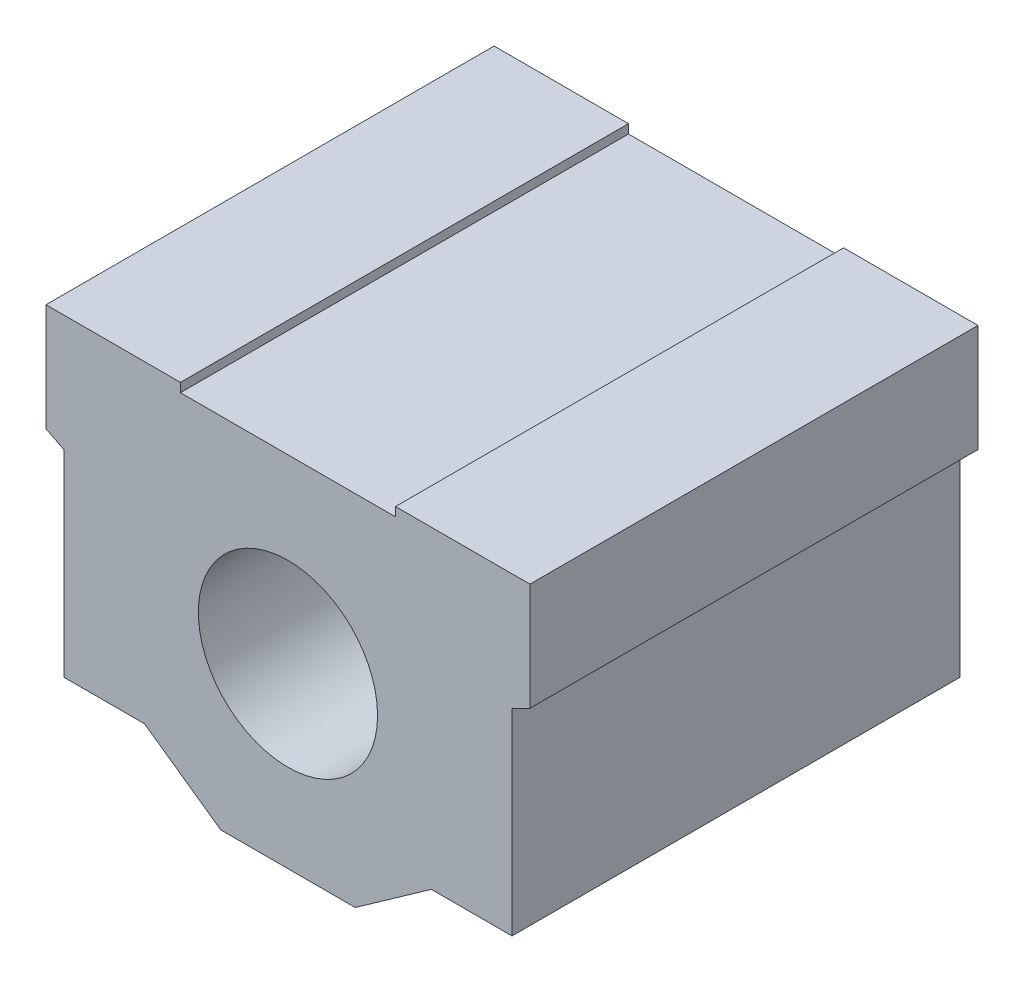
ISO-10303-21;
HEADER;
FILE_DESCRIPTION(('STEP AP214'),'2;1');
FILE_NAME('part.step','',(''),(''),'','','');
FILE_SCHEMA(('AUTOMOTIVE_DESIGN { 1 0 10303 214 1 1 1 1 }'));
ENDSEC;
DATA;
#1=APPLICATION_CONTEXT('core data for automotive mechanical design processes');
#2=APPLICATION_PROTOCOL_DEFINITION('international standard','automotive_design',2000,#1);
#3=PRODUCT_CONTEXT('',#1,'mechanical');
#4=PRODUCT('Part','Part','',(#3));
#5=PRODUCT_RELATED_PRODUCT_CATEGORY('part','',(#4));
#6=PRODUCT_DEFINITION_FORMATION('','',#4);
#7=PRODUCT_DEFINITION_CONTEXT('part definition',#1,'design');
#8=PRODUCT_DEFINITION('design','',#6,#7);
#9=PRODUCT_DEFINITION_SHAPE('','',#8);
#10=(LENGTH_UNIT() NAMED_UNIT(*) SI_UNIT(.MILLI.,.METRE.));
#11=(NAMED_UNIT(*) PLANE_ANGLE_UNIT() SI_UNIT($,.RADIAN.));
#12=(NAMED_UNIT(*) SI_UNIT($,.STERADIAN.) SOLID_ANGLE_UNIT());
#13=UNCERTAINTY_MEASURE_WITH_UNIT(LENGTH_MEASURE(1.E-05),#10,'distance_accuracy_value','');
#14=(GEOMETRIC_REPRESENTATION_CONTEXT(3) GLOBAL_UNCERTAINTY_ASSIGNED_CONTEXT((#13)) GLOBAL_UNIT_ASSIGNED_CONTEXT((#10,
#11,#12)) REPRESENTATION_CONTEXT('',''));
#15=CARTESIAN_POINT('',(0.,0.,0.));
#16=DIRECTION('',(0.,0.,1.));
#17=DIRECTION('',(1.,0.,0.));
#18=AXIS2_PLACEMENT_3D('',#15,#16,#17);
#19=CARTESIAN_POINT('',(0.,0.,50.));
#20=DIRECTION('',(0.,0.,-1.));
#21=DIRECTION('',(-1.,0.,0.));
#22=AXIS2_PLACEMENT_3D('',#19,#20,#21);
#23=PLANE('',#22);
#24=DIRECTION('',(0.816967863264762,-0.576683197598654,0.));
#25=VECTOR('',#24,1.);
#26=CARTESIAN_POINT('',(-7.49999999999999,0.,50.));
#27=LINE('',#26,#25);
#28=CARTESIAN_POINT('',(-16.,5.99999999999999,50.));
#29=VERTEX_POINT('',#28);
#30=CARTESIAN_POINT('',(-7.49999999999999,0.,50.));
#31=VERTEX_POINT('',#30);
#32=EDGE_CURVE('E212',#29,#31,#27,.T.);
#33=ORIENTED_EDGE('',*,*,#32,.T.);
#34=DIRECTION('',(1.,0.,0.));
#35=VECTOR('',#34,1.);
#36=CARTESIAN_POINT('',(7.50000000000001,0.,50.));
#37=LINE('',#36,#35);
#38=CARTESIAN_POINT('',(7.50000000000001,0.,50.));
#39=VERTEX_POINT('',#38);
#40=EDGE_CURVE('E120',#31,#39,#37,.T.);
#41=ORIENTED_EDGE('',*,*,#40,.T.);
#42=DIRECTION('',(0.816967863264762,0.576683197598655,0.));
#43=VECTOR('',#42,1.);
#44=CARTESIAN_POINT('',(7.50000000000001,0.,50.));
#45=LINE('',#44,#43);
#46=CARTESIAN_POINT('',(16.,5.99999999999999,50.));
#47=VERTEX_POINT('',#46);
#48=EDGE_CURVE('E251',#39,#47,#45,.T.);
#49=ORIENTED_EDGE('',*,*,#48,.T.);
#50=DIRECTION('',(1.,0.,0.));
#51=VECTOR('',#50,1.);
#52=CARTESIAN_POINT('',(16.,5.99999999999999,50.));
#53=LINE('',#52,#51);
#54=CARTESIAN_POINT('',(25.,5.99999999999999,50.));
#55=VERTEX_POINT('',#54);
#56=EDGE_CURVE('E270',#47,#55,#53,.T.);
#57=ORIENTED_EDGE('',*,*,#56,.T.);
#58=DIRECTION('',(0.,1.,0.));
#59=VECTOR('',#58,1.);
#60=CARTESIAN_POINT('',(25.,5.99999999999999,50.));
#61=LINE('',#60,#59);
#62=CARTESIAN_POINT('',(25.,28.,50.));
#63=VERTEX_POINT('',#62);
#64=EDGE_CURVE('E267',#55,#63,#61,.T.);
#65=ORIENTED_EDGE('',*,*,#64,.T.);
#66=DIRECTION('',(0.894427190999913,0.447213595499964,0.));
#67=VECTOR('',#66,1.);
#68=CARTESIAN_POINT('',(25.,28.,50.));
#69=LINE('',#68,#67);
#70=CARTESIAN_POINT('',(27.,29.,50.));
#71=VERTEX_POINT('',#70);
#72=EDGE_CURVE('E269',#63,#71,#69,.T.);
#73=ORIENTED_EDGE('',*,*,#72,.T.);
#74=DIRECTION('',(0.,1.,0.));
#75=VECTOR('',#74,1.);
#76=CARTESIAN_POINT('',(27.,29.,50.));
#77=LINE('',#76,#75);
#78=CARTESIAN_POINT('',(27.,41.,50.));
#79=VERTEX_POINT('',#78);
#80=EDGE_CURVE('E272',#71,#79,#77,.T.);
#81=ORIENTED_EDGE('',*,*,#80,.T.);
#82=DIRECTION('',(-1.,0.,0.));
#83=VECTOR('',#82,1.);
#84=CARTESIAN_POINT('',(27.,41.,50.));
#85=LINE('',#84,#83);
#86=CARTESIAN_POINT('',(12.,41.,50.));
#87=VERTEX_POINT('',#86);
#88=EDGE_CURVE('E278',#79,#87,#85,.T.);
#89=ORIENTED_EDGE('',*,*,#88,.T.);
#90=DIRECTION('',(0.,-1.,0.));
#91=VECTOR('',#90,1.);
#92=CARTESIAN_POINT('',(12.,41.,50.));
#93=LINE('',#92,#91);
#94=CARTESIAN_POINT('',(12.,40.,50.));
#95=VERTEX_POINT('',#94);
#96=EDGE_CURVE('E280',#87,#95,#93,.T.);
#97=ORIENTED_EDGE('',*,*,#96,.T.);
#98=DIRECTION('',(-1.,0.,0.));
#99=VECTOR('',#98,1.);
#100=CARTESIAN_POINT('',(-12.,40.,50.));
#101=LINE('',#100,#99);
#102=CARTESIAN_POINT('',(-12.,40.,50.));
#103=VERTEX_POINT('',#102);
#104=EDGE_CURVE('E282',#95,#103,#101,.T.);
#105=ORIENTED_EDGE('',*,*,#104,.T.);
#106=DIRECTION('',(0.,1.,0.));
#107=VECTOR('',#106,1.);
#108=CARTESIAN_POINT('',(-12.,41.,50.));
#109=LINE('',#108,#107);
#110=CARTESIAN_POINT('',(-12.,41.,50.));
#111=VERTEX_POINT('',#110);
#112=EDGE_CURVE('E284',#103,#111,#109,.T.);
#113=ORIENTED_EDGE('',*,*,#112,.T.);
#114=DIRECTION('',(-1.,0.,0.));
#115=VECTOR('',#114,1.);
#116=CARTESIAN_POINT('',(-27.,41.,50.));
#117=LINE('',#116,#115);
#118=CARTESIAN_POINT('',(-27.,41.,50.));
#119=VERTEX_POINT('',#118);
#120=EDGE_CURVE('E286',#111,#119,#117,.T.);
#121=ORIENTED_EDGE('',*,*,#120,.T.);
#122=DIRECTION('',(0.,-1.,0.));
#123=VECTOR('',#122,1.);
#124=CARTESIAN_POINT('',(-27.,29.,50.));
#125=LINE('',#124,#123);
#126=CARTESIAN_POINT('',(-27.,29.,50.));
#127=VERTEX_POINT('',#126);
#128=EDGE_CURVE('E163',#119,#127,#125,.T.);
#129=ORIENTED_EDGE('',*,*,#128,.T.);
#130=DIRECTION('',(0.894427190999913,-0.447213595499964,0.));
#131=VECTOR('',#130,1.);
#132=CARTESIAN_POINT('',(-25.,28.,50.));
#133=LINE('',#132,#131);
#134=CARTESIAN_POINT('',(-25.,28.,50.));
#135=VERTEX_POINT('',#134);
#136=EDGE_CURVE('E157',#127,#135,#133,.T.);
#137=ORIENTED_EDGE('',*,*,#136,.T.);
#138=DIRECTION('',(0.,-1.,0.));
#139=VECTOR('',#138,1.);
#140=CARTESIAN_POINT('',(-25.,5.99999999999999,50.));
#141=LINE('',#140,#139);
#142=CARTESIAN_POINT('',(-25.,5.99999999999999,50.));
#143=VERTEX_POINT('',#142);
#144=EDGE_CURVE('E161',#135,#143,#141,.T.);
#145=ORIENTED_EDGE('',*,*,#144,.T.);
#146=DIRECTION('',(1.,0.,0.));
#147=VECTOR('',#146,1.);
#148=CARTESIAN_POINT('',(-16.,5.99999999999999,50.));
#149=LINE('',#148,#147);
#150=EDGE_CURVE('E53',#143,#29,#149,.T.);
#151=ORIENTED_EDGE('',*,*,#150,.T.);
#152=EDGE_LOOP('',(#33,#41,#49,#57,#65,#73,#81,#89,#97,#105,#113,#121,#129,#137,#145,#151));
#153=FACE_BOUND('',#152,.T.);
#154=CARTESIAN_POINT('',(0.,19.8,50.));
#155=DIRECTION('',(0.,0.,1.));
#156=DIRECTION('',(1.,0.,0.));
#157=AXIS2_PLACEMENT_3D('',#154,#155,#156);
#158=CIRCLE('',#157,10.);
#159=CARTESIAN_POINT('',(10.,19.8,50.));
#160=VERTEX_POINT('',#159);
#161=EDGE_CURVE('E185',#160,#160,#158,.T.);
#162=ORIENTED_EDGE('',*,*,#161,.F.);
#163=EDGE_LOOP('',(#162));
#164=FACE_BOUND('',#163,.T.);
#165=ADVANCED_FACE('F36',(#153,#164),#23,.F.);
#166=CARTESIAN_POINT('',(0.,0.,0.));
#167=DIRECTION('',(0.,0.,-1.));
#168=DIRECTION('',(-1.,0.,0.));
#169=AXIS2_PLACEMENT_3D('',#166,#167,#168);
#170=PLANE('',#169);
#171=DIRECTION('',(0.816967863264762,-0.576683197598654,0.));
#172=VECTOR('',#171,1.);
#173=CARTESIAN_POINT('',(-7.49999999999999,0.,0.));
#174=LINE('',#173,#172);
#175=CARTESIAN_POINT('',(-16.,5.99999999999999,0.));
#176=VERTEX_POINT('',#175);
#177=CARTESIAN_POINT('',(-7.49999999999999,0.,0.));
#178=VERTEX_POINT('',#177);
#179=EDGE_CURVE('E181',#176,#178,#174,.T.);
#180=ORIENTED_EDGE('',*,*,#179,.F.);
#181=DIRECTION('',(1.,0.,0.));
#182=VECTOR('',#181,1.);
#183=CARTESIAN_POINT('',(-16.,5.99999999999999,0.));
#184=LINE('',#183,#182);
#185=CARTESIAN_POINT('',(-25.,5.99999999999999,0.));
#186=VERTEX_POINT('',#185);
#187=EDGE_CURVE('E112',#186,#176,#184,.T.);
#188=ORIENTED_EDGE('',*,*,#187,.F.);
#189=DIRECTION('',(0.,-1.,0.));
#190=VECTOR('',#189,1.);
#191=CARTESIAN_POINT('',(-25.,5.99999999999999,0.));
#192=LINE('',#191,#190);
#193=CARTESIAN_POINT('',(-25.,28.,0.));
#194=VERTEX_POINT('',#193);
#195=EDGE_CURVE('E106',#194,#186,#192,.T.);
#196=ORIENTED_EDGE('',*,*,#195,.F.);
#197=DIRECTION('',(0.894427190999913,-0.447213595499964,0.));
#198=VECTOR('',#197,1.);
#199=CARTESIAN_POINT('',(-25.,28.,0.));
#200=LINE('',#199,#198);
#201=CARTESIAN_POINT('',(-27.,29.,0.));
#202=VERTEX_POINT('',#201);
#203=EDGE_CURVE('E171',#202,#194,#200,.T.);
#204=ORIENTED_EDGE('',*,*,#203,.F.);
#205=DIRECTION('',(0.,-1.,0.));
#206=VECTOR('',#205,1.);
#207=CARTESIAN_POINT('',(-27.,29.,0.));
#208=LINE('',#207,#206);
#209=CARTESIAN_POINT('',(-27.,41.,0.));
#210=VERTEX_POINT('',#209);
#211=EDGE_CURVE('E207',#210,#202,#208,.T.);
#212=ORIENTED_EDGE('',*,*,#211,.F.);
#213=DIRECTION('',(-1.,0.,0.));
#214=VECTOR('',#213,1.);
#215=CARTESIAN_POINT('',(-27.,41.,0.));
#216=LINE('',#215,#214);
#217=CARTESIAN_POINT('',(-12.,41.,0.));
#218=VERTEX_POINT('',#217);
#219=EDGE_CURVE('E205',#218,#210,#216,.T.);
#220=ORIENTED_EDGE('',*,*,#219,.F.);
#221=DIRECTION('',(0.,1.,0.));
#222=VECTOR('',#221,1.);
#223=CARTESIAN_POINT('',(-12.,41.,0.));
#224=LINE('',#223,#222);
#225=CARTESIAN_POINT('',(-12.,40.,0.));
#226=VERTEX_POINT('',#225);
#227=EDGE_CURVE('E203',#226,#218,#224,.T.);
#228=ORIENTED_EDGE('',*,*,#227,.F.);
#229=DIRECTION('',(-1.,0.,0.));
#230=VECTOR('',#229,1.);
#231=CARTESIAN_POINT('',(-12.,40.,0.));
#232=LINE('',#231,#230);
#233=CARTESIAN_POINT('',(12.,40.,0.));
#234=VERTEX_POINT('',#233);
#235=EDGE_CURVE('E201',#234,#226,#232,.T.);
#236=ORIENTED_EDGE('',*,*,#235,.F.);
#237=DIRECTION('',(0.,-1.,0.));
#238=VECTOR('',#237,1.);
#239=CARTESIAN_POINT('',(12.,41.,0.));
#240=LINE('',#239,#238);
#241=CARTESIAN_POINT('',(12.,41.,0.));
#242=VERTEX_POINT('',#241);
#243=EDGE_CURVE('E199',#242,#234,#240,.T.);
#244=ORIENTED_EDGE('',*,*,#243,.F.);
#245=DIRECTION('',(-1.,0.,0.));
#246=VECTOR('',#245,1.);
#247=CARTESIAN_POINT('',(27.,41.,0.));
#248=LINE('',#247,#246);
#249=CARTESIAN_POINT('',(27.,41.,0.));
#250=VERTEX_POINT('',#249);
#251=EDGE_CURVE('E197',#250,#242,#248,.T.);
#252=ORIENTED_EDGE('',*,*,#251,.F.);
#253=DIRECTION('',(0.,1.,0.));
#254=VECTOR('',#253,1.);
#255=CARTESIAN_POINT('',(27.,29.,0.));
#256=LINE('',#255,#254);
#257=CARTESIAN_POINT('',(27.,29.,0.));
#258=VERTEX_POINT('',#257);
#259=EDGE_CURVE('E195',#258,#250,#256,.T.);
#260=ORIENTED_EDGE('',*,*,#259,.F.);
#261=DIRECTION('',(0.894427190999913,0.447213595499964,0.));
#262=VECTOR('',#261,1.);
#263=CARTESIAN_POINT('',(25.,28.,0.));
#264=LINE('',#263,#262);
#265=CARTESIAN_POINT('',(25.,28.,0.));
#266=VERTEX_POINT('',#265);
#267=EDGE_CURVE('E193',#266,#258,#264,.T.);
#268=ORIENTED_EDGE('',*,*,#267,.F.);
#269=DIRECTION('',(0.,1.,0.));
#270=VECTOR('',#269,1.);
#271=CARTESIAN_POINT('',(25.,5.99999999999999,0.));
#272=LINE('',#271,#270);
#273=CARTESIAN_POINT('',(25.,5.99999999999999,0.));
#274=VERTEX_POINT('',#273);
#275=EDGE_CURVE('E191',#274,#266,#272,.T.);
#276=ORIENTED_EDGE('',*,*,#275,.F.);
#277=DIRECTION('',(1.,0.,0.));
#278=VECTOR('',#277,1.);
#279=CARTESIAN_POINT('',(16.,5.99999999999999,0.));
#280=LINE('',#279,#278);
#281=CARTESIAN_POINT('',(16.,5.99999999999999,0.));
#282=VERTEX_POINT('',#281);
#283=EDGE_CURVE('E189',#282,#274,#280,.T.);
#284=ORIENTED_EDGE('',*,*,#283,.F.);
#285=DIRECTION('',(0.816967863264762,0.576683197598655,0.));
#286=VECTOR('',#285,1.);
#287=CARTESIAN_POINT('',(7.50000000000001,0.,0.));
#288=LINE('',#287,#286);
#289=CARTESIAN_POINT('',(7.50000000000001,0.,0.));
#290=VERTEX_POINT('',#289);
#291=EDGE_CURVE('E187',#290,#282,#288,.T.);
#292=ORIENTED_EDGE('',*,*,#291,.F.);
#293=DIRECTION('',(1.,0.,0.));
#294=VECTOR('',#293,1.);
#295=CARTESIAN_POINT('',(7.50000000000001,0.,0.));
#296=LINE('',#295,#294);
#297=EDGE_CURVE('E184',#178,#290,#296,.T.);
#298=ORIENTED_EDGE('',*,*,#297,.F.);
#299=EDGE_LOOP('',(#180,#188,#196,#204,#212,#220,#228,#236,#244,#252,#260,#268,#276,#284,#292,#298));
#300=FACE_BOUND('',#299,.T.);
#301=CARTESIAN_POINT('',(0.,19.8,0.));
#302=DIRECTION('',(0.,0.,1.));
#303=DIRECTION('',(1.,0.,0.));
#304=AXIS2_PLACEMENT_3D('',#301,#302,#303);
#305=CIRCLE('',#304,10.);
#306=CARTESIAN_POINT('',(10.,19.8,0.));
#307=VERTEX_POINT('',#306);
#308=EDGE_CURVE('E485',#307,#307,#305,.T.);
#309=ORIENTED_EDGE('',*,*,#308,.T.);
#310=EDGE_LOOP('',(#309));
#311=FACE_BOUND('',#310,.T.);
#312=ADVANCED_FACE('F255',(#300,#311),#170,.T.);
#313=CARTESIAN_POINT('',(-7.49999999999999,0.,50.));
#314=DIRECTION('',(0.576683197598654,0.816967863264762,0.));
#315=DIRECTION('',(-0.816967863264762,0.576683197598654,0.));
#316=AXIS2_PLACEMENT_3D('',#313,#314,#315);
#317=PLANE('',#316);
#318=ORIENTED_EDGE('',*,*,#179,.T.);
#319=DIRECTION('',(0.,0.,-1.));
#320=VECTOR('',#319,1.);
#321=CARTESIAN_POINT('',(-7.49999999999999,0.,50.));
#322=LINE('',#321,#320);
#323=EDGE_CURVE('E11',#31,#178,#322,.T.);
#324=ORIENTED_EDGE('',*,*,#323,.F.);
#325=ORIENTED_EDGE('',*,*,#32,.F.);
#326=DIRECTION('',(0.,0.,-1.));
#327=VECTOR('',#326,1.);
#328=CARTESIAN_POINT('',(-16.,5.99999999999999,50.));
#329=LINE('',#328,#327);
#330=EDGE_CURVE('E177',#29,#176,#329,.T.);
#331=ORIENTED_EDGE('',*,*,#330,.T.);
#332=EDGE_LOOP('',(#318,#324,#325,#331));
#333=FACE_BOUND('',#332,.T.);
#334=ADVANCED_FACE('F38',(#333),#317,.F.);
#335=CARTESIAN_POINT('',(7.50000000000001,0.,50.));
#336=DIRECTION('',(0.,1.,0.));
#337=DIRECTION('',(-1.,0.,0.));
#338=AXIS2_PLACEMENT_3D('',#335,#336,#337);
#339=PLANE('',#338);
#340=ORIENTED_EDGE('',*,*,#297,.T.);
#341=DIRECTION('',(0.,0.,-1.));
#342=VECTOR('',#341,1.);
#343=CARTESIAN_POINT('',(7.50000000000001,0.,50.));
#344=LINE('',#343,#342);
#345=EDGE_CURVE('E45',#39,#290,#344,.T.);
#346=ORIENTED_EDGE('',*,*,#345,.F.);
#347=ORIENTED_EDGE('',*,*,#40,.F.);
#348=ORIENTED_EDGE('',*,*,#323,.T.);
#349=EDGE_LOOP('',(#340,#346,#347,#348));
#350=FACE_BOUND('',#349,.T.);
#351=ADVANCED_FACE('F320',(#350),#339,.F.);
#352=CARTESIAN_POINT('',(7.50000000000001,0.,50.));
#353=DIRECTION('',(-0.576683197598655,0.816967863264762,0.));
#354=DIRECTION('',(-0.816967863264762,-0.576683197598655,0.));
#355=AXIS2_PLACEMENT_3D('',#352,#353,#354);
#356=PLANE('',#355);
#357=ORIENTED_EDGE('',*,*,#291,.T.);
#358=DIRECTION('',(0.,0.,-1.));
#359=VECTOR('',#358,1.);
#360=CARTESIAN_POINT('',(16.,5.99999999999999,50.));
#361=LINE('',#360,#359);
#362=EDGE_CURVE('E243',#47,#282,#361,.T.);
#363=ORIENTED_EDGE('',*,*,#362,.F.);
#364=ORIENTED_EDGE('',*,*,#48,.F.);
#365=ORIENTED_EDGE('',*,*,#345,.T.);
#366=EDGE_LOOP('',(#357,#363,#364,#365));
#367=FACE_BOUND('',#366,.T.);
#368=ADVANCED_FACE('F249',(#367),#356,.F.);
#369=CARTESIAN_POINT('',(16.,5.99999999999999,50.));
#370=DIRECTION('',(0.,1.,0.));
#371=DIRECTION('',(-1.,0.,0.));
#372=AXIS2_PLACEMENT_3D('',#369,#370,#371);
#373=PLANE('',#372);
#374=ORIENTED_EDGE('',*,*,#283,.T.);
#375=DIRECTION('',(0.,0.,-1.));
#376=VECTOR('',#375,1.);
#377=CARTESIAN_POINT('',(25.,5.99999999999999,50.));
#378=LINE('',#377,#376);
#379=EDGE_CURVE('E240',#55,#274,#378,.T.);
#380=ORIENTED_EDGE('',*,*,#379,.F.);
#381=ORIENTED_EDGE('',*,*,#56,.F.);
#382=ORIENTED_EDGE('',*,*,#362,.T.);
#383=EDGE_LOOP('',(#374,#380,#381,#382));
#384=FACE_BOUND('',#383,.T.);
#385=ADVANCED_FACE('F261',(#384),#373,.F.);
#386=CARTESIAN_POINT('',(25.,5.99999999999999,50.));
#387=DIRECTION('',(-1.,0.,0.));
#388=DIRECTION('',(0.,-1.,0.));
#389=AXIS2_PLACEMENT_3D('',#386,#387,#388);
#390=PLANE('',#389);
#391=ORIENTED_EDGE('',*,*,#275,.T.);
#392=DIRECTION('',(0.,0.,-1.));
#393=VECTOR('',#392,1.);
#394=CARTESIAN_POINT('',(25.,28.,50.));
#395=LINE('',#394,#393);
#396=EDGE_CURVE('E237',#63,#266,#395,.T.);
#397=ORIENTED_EDGE('',*,*,#396,.F.);
#398=ORIENTED_EDGE('',*,*,#64,.F.);
#399=ORIENTED_EDGE('',*,*,#379,.T.);
#400=EDGE_LOOP('',(#391,#397,#398,#399));
#401=FACE_BOUND('',#400,.T.);
#402=ADVANCED_FACE('F265',(#401),#390,.F.);
#403=CARTESIAN_POINT('',(25.,28.,50.));
#404=DIRECTION('',(-0.447213595499964,0.894427190999913,0.));
#405=DIRECTION('',(-0.894427190999913,-0.447213595499964,0.));
#406=AXIS2_PLACEMENT_3D('',#403,#404,#405);
#407=PLANE('',#406);
#408=ORIENTED_EDGE('',*,*,#267,.T.);
#409=DIRECTION('',(0.,0.,-1.));
#410=VECTOR('',#409,1.);
#411=CARTESIAN_POINT('',(27.,29.,50.));
#412=LINE('',#411,#410);
#413=EDGE_CURVE('E234',#71,#258,#412,.T.);
#414=ORIENTED_EDGE('',*,*,#413,.F.);
#415=ORIENTED_EDGE('',*,*,#72,.F.);
#416=ORIENTED_EDGE('',*,*,#396,.T.);
#417=EDGE_LOOP('',(#408,#414,#415,#416));
#418=FACE_BOUND('',#417,.T.);
#419=ADVANCED_FACE('F333',(#418),#407,.F.);
#420=CARTESIAN_POINT('',(27.,29.,50.));
#421=DIRECTION('',(-1.,0.,0.));
#422=DIRECTION('',(0.,0.,1.));
#423=AXIS2_PLACEMENT_3D('',#420,#421,#422);
#424=PLANE('',#423);
#425=ORIENTED_EDGE('',*,*,#259,.T.);
#426=DIRECTION('',(0.,0.,-1.));
#427=VECTOR('',#426,1.);
#428=CARTESIAN_POINT('',(27.,41.,50.));
#429=LINE('',#428,#427);
#430=EDGE_CURVE('E231',#79,#250,#429,.T.);
#431=ORIENTED_EDGE('',*,*,#430,.F.);
#432=ORIENTED_EDGE('',*,*,#80,.F.);
#433=ORIENTED_EDGE('',*,*,#413,.T.);
#434=EDGE_LOOP('',(#425,#431,#432,#433));
#435=FACE_BOUND('',#434,.T.);
#436=ADVANCED_FACE('F336',(#435),#424,.F.);
#437=CARTESIAN_POINT('',(27.,41.,50.));
#438=DIRECTION('',(0.,-1.,0.));
#439=DIRECTION('',(1.,0.,0.));
#440=AXIS2_PLACEMENT_3D('',#437,#438,#439);
#441=PLANE('',#440);
#442=ORIENTED_EDGE('',*,*,#251,.T.);
#443=DIRECTION('',(0.,0.,-1.));
#444=VECTOR('',#443,1.);
#445=CARTESIAN_POINT('',(12.,41.,50.));
#446=LINE('',#445,#444);
#447=EDGE_CURVE('E228',#87,#242,#446,.T.);
#448=ORIENTED_EDGE('',*,*,#447,.F.);
#449=ORIENTED_EDGE('',*,*,#88,.F.);
#450=ORIENTED_EDGE('',*,*,#430,.T.);
#451=EDGE_LOOP('',(#442,#448,#449,#450));
#452=FACE_BOUND('',#451,.T.);
#453=ADVANCED_FACE('F340',(#452),#441,.F.);
#454=CARTESIAN_POINT('',(12.,41.,50.));
#455=DIRECTION('',(1.,0.,0.));
#456=DIRECTION('',(0.,0.,-1.));
#457=AXIS2_PLACEMENT_3D('',#454,#455,#456);
#458=PLANE('',#457);
#459=ORIENTED_EDGE('',*,*,#243,.T.);
#460=DIRECTION('',(0.,0.,-1.));
#461=VECTOR('',#460,1.);
#462=CARTESIAN_POINT('',(12.,40.,50.));
#463=LINE('',#462,#461);
#464=EDGE_CURVE('E225',#95,#234,#463,.T.);
#465=ORIENTED_EDGE('',*,*,#464,.F.);
#466=ORIENTED_EDGE('',*,*,#96,.F.);
#467=ORIENTED_EDGE('',*,*,#447,.T.);
#468=EDGE_LOOP('',(#459,#465,#466,#467));
#469=FACE_BOUND('',#468,.T.);
#470=ADVANCED_FACE('F344',(#469),#458,.F.);
#471=CARTESIAN_POINT('',(-12.,40.,50.));
#472=DIRECTION('',(0.,-1.,0.));
#473=DIRECTION('',(0.,0.,-1.));
#474=AXIS2_PLACEMENT_3D('',#471,#472,#473);
#475=PLANE('',#474);
#476=ORIENTED_EDGE('',*,*,#235,.T.);
#477=DIRECTION('',(0.,0.,-1.));
#478=VECTOR('',#477,1.);
#479=CARTESIAN_POINT('',(-12.,40.,50.));
#480=LINE('',#479,#478);
#481=EDGE_CURVE('E222',#103,#226,#480,.T.);
#482=ORIENTED_EDGE('',*,*,#481,.F.);
#483=ORIENTED_EDGE('',*,*,#104,.F.);
#484=ORIENTED_EDGE('',*,*,#464,.T.);
#485=EDGE_LOOP('',(#476,#482,#483,#484));
#486=FACE_BOUND('',#485,.T.);
#487=ADVANCED_FACE('F348',(#486),#475,.F.);
#488=CARTESIAN_POINT('',(-12.,41.,50.));
#489=DIRECTION('',(-1.,0.,0.));
#490=DIRECTION('',(0.,0.,1.));
#491=AXIS2_PLACEMENT_3D('',#488,#489,#490);
#492=PLANE('',#491);
#493=ORIENTED_EDGE('',*,*,#227,.T.);
#494=DIRECTION('',(0.,0.,-1.));
#495=VECTOR('',#494,1.);
#496=CARTESIAN_POINT('',(-12.,41.,50.));
#497=LINE('',#496,#495);
#498=EDGE_CURVE('E219',#111,#218,#497,.T.);
#499=ORIENTED_EDGE('',*,*,#498,.F.);
#500=ORIENTED_EDGE('',*,*,#112,.F.);
#501=ORIENTED_EDGE('',*,*,#481,.T.);
#502=EDGE_LOOP('',(#493,#499,#500,#501));
#503=FACE_BOUND('',#502,.T.);
#504=ADVANCED_FACE('F352',(#503),#492,.F.);
#505=CARTESIAN_POINT('',(-27.,41.,50.));
#506=DIRECTION('',(0.,-1.,0.));
#507=DIRECTION('',(0.,0.,-1.));
#508=AXIS2_PLACEMENT_3D('',#505,#506,#507);
#509=PLANE('',#508);
#510=ORIENTED_EDGE('',*,*,#219,.T.);
#511=DIRECTION('',(0.,0.,-1.));
#512=VECTOR('',#511,1.);
#513=CARTESIAN_POINT('',(-27.,41.,50.));
#514=LINE('',#513,#512);
#515=EDGE_CURVE('E216',#119,#210,#514,.T.);
#516=ORIENTED_EDGE('',*,*,#515,.F.);
#517=ORIENTED_EDGE('',*,*,#120,.F.);
#518=ORIENTED_EDGE('',*,*,#498,.T.);
#519=EDGE_LOOP('',(#510,#516,#517,#518));
#520=FACE_BOUND('',#519,.T.);
#521=ADVANCED_FACE('F292',(#520),#509,.F.);
#522=CARTESIAN_POINT('',(-27.,29.,50.));
#523=DIRECTION('',(1.,0.,0.));
#524=DIRECTION('',(0.,0.,-1.));
#525=AXIS2_PLACEMENT_3D('',#522,#523,#524);
#526=PLANE('',#525);
#527=ORIENTED_EDGE('',*,*,#211,.T.);
#528=DIRECTION('',(0.,0.,-1.));
#529=VECTOR('',#528,1.);
#530=CARTESIAN_POINT('',(-27.,29.,50.));
#531=LINE('',#530,#529);
#532=EDGE_CURVE('E172',#127,#202,#531,.T.);
#533=ORIENTED_EDGE('',*,*,#532,.F.);
#534=ORIENTED_EDGE('',*,*,#128,.F.);
#535=ORIENTED_EDGE('',*,*,#515,.T.);
#536=EDGE_LOOP('',(#527,#533,#534,#535));
#537=FACE_BOUND('',#536,.T.);
#538=ADVANCED_FACE('F296',(#537),#526,.F.);
#539=CARTESIAN_POINT('',(-25.,28.,50.));
#540=DIRECTION('',(0.447213595499964,0.894427190999913,0.));
#541=DIRECTION('',(-0.894427190999913,0.447213595499964,0.));
#542=AXIS2_PLACEMENT_3D('',#539,#540,#541);
#543=PLANE('',#542);
#544=ORIENTED_EDGE('',*,*,#203,.T.);
#545=DIRECTION('',(0.,0.,-1.));
#546=VECTOR('',#545,1.);
#547=CARTESIAN_POINT('',(-25.,28.,50.));
#548=LINE('',#547,#546);
#549=EDGE_CURVE('E168',#135,#194,#548,.T.);
#550=ORIENTED_EDGE('',*,*,#549,.F.);
#551=ORIENTED_EDGE('',*,*,#136,.F.);
#552=ORIENTED_EDGE('',*,*,#532,.T.);
#553=EDGE_LOOP('',(#544,#550,#551,#552));
#554=FACE_BOUND('',#553,.T.);
#555=ADVANCED_FACE('F169',(#554),#543,.F.);
#556=CARTESIAN_POINT('',(-25.,5.99999999999999,50.));
#557=DIRECTION('',(1.,0.,0.));
#558=DIRECTION('',(0.,0.,-1.));
#559=AXIS2_PLACEMENT_3D('',#556,#557,#558);
#560=PLANE('',#559);
#561=ORIENTED_EDGE('',*,*,#195,.T.);
#562=DIRECTION('',(0.,0.,-1.));
#563=VECTOR('',#562,1.);
#564=CARTESIAN_POINT('',(-25.,5.99999999999999,50.));
#565=LINE('',#564,#563);
#566=EDGE_CURVE('E173',#143,#186,#565,.T.);
#567=ORIENTED_EDGE('',*,*,#566,.F.);
#568=ORIENTED_EDGE('',*,*,#144,.F.);
#569=ORIENTED_EDGE('',*,*,#549,.T.);
#570=EDGE_LOOP('',(#561,#567,#568,#569));
#571=FACE_BOUND('',#570,.T.);
#572=ADVANCED_FACE('F175',(#571),#560,.F.);
#573=CARTESIAN_POINT('',(-16.,5.99999999999999,50.));
#574=DIRECTION('',(0.,1.,0.));
#575=DIRECTION('',(-1.,0.,0.));
#576=AXIS2_PLACEMENT_3D('',#573,#574,#575);
#577=PLANE('',#576);
#578=ORIENTED_EDGE('',*,*,#187,.T.);
#579=ORIENTED_EDGE('',*,*,#330,.F.);
#580=ORIENTED_EDGE('',*,*,#150,.F.);
#581=ORIENTED_EDGE('',*,*,#566,.T.);
#582=EDGE_LOOP('',(#578,#579,#580,#581));
#583=FACE_BOUND('',#582,.T.);
#584=ADVANCED_FACE('F300',(#583),#577,.F.);
#585=CARTESIAN_POINT('',(0.,19.8,50.));
#586=DIRECTION('',(0.,0.,-1.));
#587=DIRECTION('',(-1.,0.,0.));
#588=AXIS2_PLACEMENT_3D('',#585,#586,#587);
#589=CYLINDRICAL_SURFACE('',#588,10.);
#590=ORIENTED_EDGE('',*,*,#161,.T.);
#591=EDGE_LOOP('',(#590));
#592=FACE_BOUND('',#591,.T.);
#593=ORIENTED_EDGE('',*,*,#308,.F.);
#594=EDGE_LOOP('',(#593));
#595=FACE_BOUND('',#594,.T.);
#596=ADVANCED_FACE('F302',(#592,#595),#589,.F.);
#597=CLOSED_SHELL('',(#165,#312,#334,#351,#368,#385,#402,#419,#436,#453,#470,#487,#504,#521,
#538,#555,#572,#584,#596));
#598=MANIFOLD_SOLID_BREP('B2',#597);
#599=ADVANCED_BREP_SHAPE_REPRESENTATION('',(#18,#598),#14);
#600=SHAPE_DEFINITION_REPRESENTATION(#9,#599);
ENDSEC;
END-ISO-10303-21;
